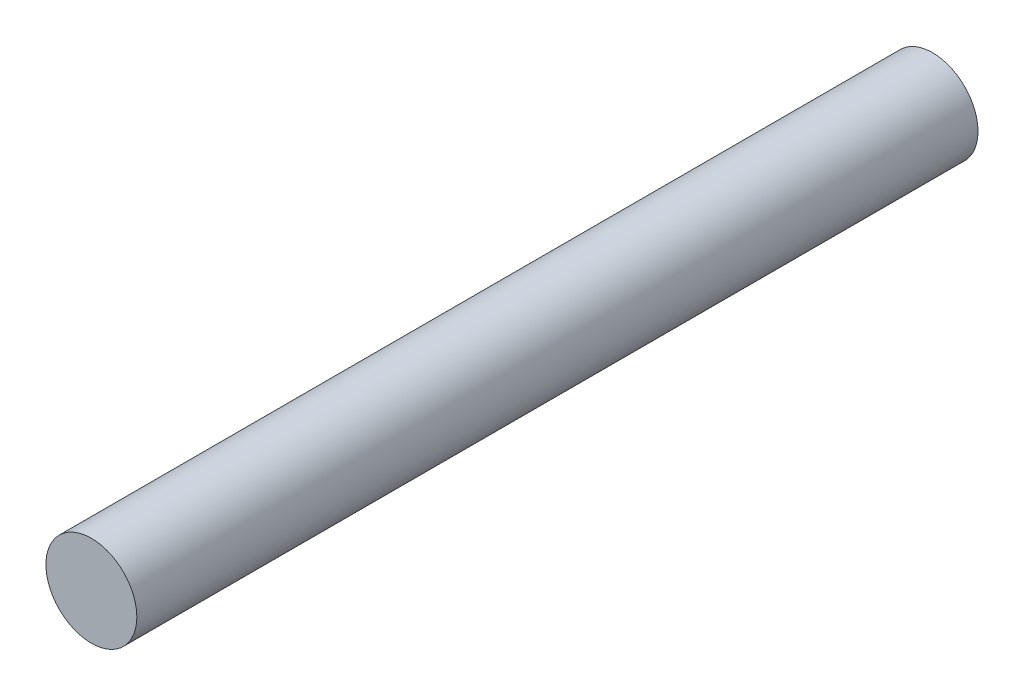
ISO-10303-21;
HEADER;
FILE_DESCRIPTION(('STEP AP214'),'2;1');
FILE_NAME('part.step','',(''),(''),'','','');
FILE_SCHEMA(('AUTOMOTIVE_DESIGN { 1 0 10303 214 1 1 1 1 }'));
ENDSEC;
DATA;
#1=APPLICATION_CONTEXT('core data for automotive mechanical design processes');
#2=APPLICATION_PROTOCOL_DEFINITION('international standard','automotive_design',2000,#1);
#3=PRODUCT_CONTEXT('',#1,'mechanical');
#4=PRODUCT('Part','Part','',(#3));
#5=PRODUCT_RELATED_PRODUCT_CATEGORY('part','',(#4));
#6=PRODUCT_DEFINITION_FORMATION('','',#4);
#7=PRODUCT_DEFINITION_CONTEXT('part definition',#1,'design');
#8=PRODUCT_DEFINITION('design','',#6,#7);
#9=PRODUCT_DEFINITION_SHAPE('','',#8);
#10=(LENGTH_UNIT() NAMED_UNIT(*) SI_UNIT(.MILLI.,.METRE.));
#11=(NAMED_UNIT(*) PLANE_ANGLE_UNIT() SI_UNIT($,.RADIAN.));
#12=(NAMED_UNIT(*) SI_UNIT($,.STERADIAN.) SOLID_ANGLE_UNIT());
#13=UNCERTAINTY_MEASURE_WITH_UNIT(LENGTH_MEASURE(1.E-05),#10,'distance_accuracy_value','');
#14=(GEOMETRIC_REPRESENTATION_CONTEXT(3) GLOBAL_UNCERTAINTY_ASSIGNED_CONTEXT((#13)) GLOBAL_UNIT_ASSIGNED_CONTEXT((#10,
#11,#12)) REPRESENTATION_CONTEXT('',''));
#15=CARTESIAN_POINT('',(0.,0.,0.));
#16=DIRECTION('',(0.,0.,1.));
#17=DIRECTION('',(1.,0.,0.));
#18=AXIS2_PLACEMENT_3D('',#15,#16,#17);
#19=CARTESIAN_POINT('',(0.,0.,37.));
#20=DIRECTION('',(0.,0.,-1.));
#21=DIRECTION('',(-1.,0.,0.));
#22=AXIS2_PLACEMENT_3D('',#19,#20,#21);
#23=CYLINDRICAL_SURFACE('',#22,2.);
#24=CARTESIAN_POINT('',(0.,0.,37.));
#25=DIRECTION('',(0.,0.,1.));
#26=DIRECTION('',(1.,0.,0.));
#27=AXIS2_PLACEMENT_3D('',#24,#25,#26);
#28=CIRCLE('',#27,2.);
#29=CARTESIAN_POINT('',(2.,0.,37.));
#30=VERTEX_POINT('',#29);
#31=EDGE_CURVE('E10',#30,#30,#28,.T.);
#32=ORIENTED_EDGE('',*,*,#31,.F.);
#33=EDGE_LOOP('',(#32));
#34=FACE_BOUND('',#33,.T.);
#35=CARTESIAN_POINT('',(0.,0.,0.));
#36=DIRECTION('',(0.,0.,1.));
#37=DIRECTION('',(1.,0.,0.));
#38=AXIS2_PLACEMENT_3D('',#35,#36,#37);
#39=CIRCLE('',#38,2.);
#40=CARTESIAN_POINT('',(2.,0.,0.));
#41=VERTEX_POINT('',#40);
#42=EDGE_CURVE('E33',#41,#41,#39,.T.);
#43=ORIENTED_EDGE('',*,*,#42,.T.);
#44=EDGE_LOOP('',(#43));
#45=FACE_BOUND('',#44,.T.);
#46=ADVANCED_FACE('F30',(#34,#45),#23,.T.);
#47=CARTESIAN_POINT('',(0.,0.,37.));
#48=DIRECTION('',(0.,0.,1.));
#49=DIRECTION('',(1.,0.,0.));
#50=AXIS2_PLACEMENT_3D('',#47,#48,#49);
#51=PLANE('',#50);
#52=ORIENTED_EDGE('',*,*,#31,.T.);
#53=EDGE_LOOP('',(#52));
#54=FACE_BOUND('',#53,.T.);
#55=ADVANCED_FACE('F45',(#54),#51,.T.);
#56=CARTESIAN_POINT('',(0.,0.,0.));
#57=DIRECTION('',(0.,0.,1.));
#58=DIRECTION('',(1.,0.,0.));
#59=AXIS2_PLACEMENT_3D('',#56,#57,#58);
#60=PLANE('',#59);
#61=ORIENTED_EDGE('',*,*,#42,.F.);
#62=EDGE_LOOP('',(#61));
#63=FACE_BOUND('',#62,.T.);
#64=ADVANCED_FACE('F43',(#63),#60,.F.);
#65=CLOSED_SHELL('',(#46,#55,#64));
#66=MANIFOLD_SOLID_BREP('B2',#65);
#67=ADVANCED_BREP_SHAPE_REPRESENTATION('',(#18,#66),#14);
#68=SHAPE_DEFINITION_REPRESENTATION(#9,#67);
ENDSEC;
END-ISO-10303-21;
